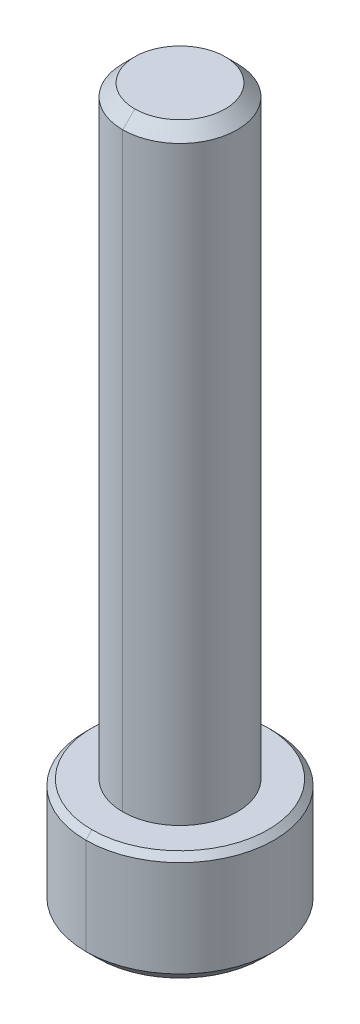
ISO-10303-21;
HEADER;
FILE_DESCRIPTION(('STEP AP214'),'2;1');
FILE_NAME('part.step','',(''),(''),'','','');
FILE_SCHEMA(('AUTOMOTIVE_DESIGN { 1 0 10303 214 1 1 1 1 }'));
ENDSEC;
DATA;
#1=APPLICATION_CONTEXT('core data for automotive mechanical design processes');
#2=APPLICATION_PROTOCOL_DEFINITION('international standard','automotive_design',2000,#1);
#3=PRODUCT_CONTEXT('',#1,'mechanical');
#4=PRODUCT('Part','Part','',(#3));
#5=PRODUCT_RELATED_PRODUCT_CATEGORY('part','',(#4));
#6=PRODUCT_DEFINITION_FORMATION('','',#4);
#7=PRODUCT_DEFINITION_CONTEXT('part definition',#1,'design');
#8=PRODUCT_DEFINITION('design','',#6,#7);
#9=PRODUCT_DEFINITION_SHAPE('','',#8);
#10=(LENGTH_UNIT() NAMED_UNIT(*) SI_UNIT(.MILLI.,.METRE.));
#11=(NAMED_UNIT(*) PLANE_ANGLE_UNIT() SI_UNIT($,.RADIAN.));
#12=(NAMED_UNIT(*) SI_UNIT($,.STERADIAN.) SOLID_ANGLE_UNIT());
#13=UNCERTAINTY_MEASURE_WITH_UNIT(LENGTH_MEASURE(1.E-05),#10,'distance_accuracy_value','');
#14=(GEOMETRIC_REPRESENTATION_CONTEXT(3) GLOBAL_UNCERTAINTY_ASSIGNED_CONTEXT((#13)) GLOBAL_UNIT_ASSIGNED_CONTEXT((#10,
#11,#12)) REPRESENTATION_CONTEXT('',''));
#15=CARTESIAN_POINT('',(0.,0.,0.));
#16=DIRECTION('',(0.,0.,1.));
#17=DIRECTION('',(1.,0.,0.));
#18=AXIS2_PLACEMENT_3D('',#15,#16,#17);
#19=CARTESIAN_POINT('',(0.,-0.253999999999994,0.));
#20=DIRECTION('',(0.,-1.,0.));
#21=DIRECTION('',(0.,0.,-1.));
#22=AXIS2_PLACEMENT_3D('',#19,#20,#21);
#23=CONICAL_SURFACE('',#22,3.96875,0.785398163397455);
#24=DIRECTION('',(0.,-0.707106781186543,0.707106781186552));
#25=VECTOR('',#24,1.);
#26=CARTESIAN_POINT('',(0.,-0.253999999999994,3.96875));
#27=LINE('',#26,#25);
#28=CARTESIAN_POINT('',(0.,0.,3.71475));
#29=VERTEX_POINT('',#28);
#30=CARTESIAN_POINT('',(0.,-0.253999999999994,3.96875));
#31=VERTEX_POINT('',#30);
#32=EDGE_CURVE('E181',#29,#31,#27,.T.);
#33=ORIENTED_EDGE('',*,*,#32,.F.);
#34=CARTESIAN_POINT('',(0.,0.,0.));
#35=DIRECTION('',(0.,1.,0.));
#36=DIRECTION('',(0.,0.,-1.));
#37=AXIS2_PLACEMENT_3D('',#34,#35,#36);
#38=CIRCLE('',#37,3.71475);
#39=CARTESIAN_POINT('',(0.,0.,-3.71475));
#40=VERTEX_POINT('',#39);
#41=EDGE_CURVE('E174',#40,#29,#38,.T.);
#42=ORIENTED_EDGE('',*,*,#41,.F.);
#43=DIRECTION('',(0.,-0.707106781186543,-0.707106781186552));
#44=VECTOR('',#43,1.);
#45=CARTESIAN_POINT('',(0.,-0.253999999999994,-3.96875));
#46=LINE('',#45,#44);
#47=CARTESIAN_POINT('',(0.,-0.253999999999994,-3.96875));
#48=VERTEX_POINT('',#47);
#49=EDGE_CURVE('E173',#40,#48,#46,.T.);
#50=ORIENTED_EDGE('',*,*,#49,.T.);
#51=CARTESIAN_POINT('',(0.,-0.253999999999994,0.));
#52=DIRECTION('',(0.,-1.,0.));
#53=DIRECTION('',(0.,0.,-1.));
#54=AXIS2_PLACEMENT_3D('',#51,#52,#53);
#55=CIRCLE('',#54,3.96875);
#56=EDGE_CURVE('E147',#31,#48,#55,.T.);
#57=ORIENTED_EDGE('',*,*,#56,.F.);
#58=EDGE_LOOP('',(#33,#42,#50,#57));
#59=FACE_BOUND('',#58,.T.);
#60=ADVANCED_FACE('F16',(#59),#23,.T.);
#61=CARTESIAN_POINT('',(0.,-4.826,0.));
#62=DIRECTION('',(0.,1.,0.));
#63=DIRECTION('',(0.,0.,1.));
#64=AXIS2_PLACEMENT_3D('',#61,#62,#63);
#65=CONICAL_SURFACE('',#64,3.46075,0.785398163397448);
#66=DIRECTION('',(0.,0.707106781186548,-0.707106781186548));
#67=VECTOR('',#66,1.);
#68=CARTESIAN_POINT('',(0.,-4.826,-3.46075));
#69=LINE('',#68,#67);
#70=CARTESIAN_POINT('',(0.,-4.826,-3.46075));
#71=VERTEX_POINT('',#70);
#72=CARTESIAN_POINT('',(0.,-4.318,-3.96875));
#73=VERTEX_POINT('',#72);
#74=EDGE_CURVE('E199',#71,#73,#69,.T.);
#75=ORIENTED_EDGE('',*,*,#74,.F.);
#76=CARTESIAN_POINT('',(0.,-4.826,0.));
#77=DIRECTION('',(0.,-1.,0.));
#78=DIRECTION('',(0.,0.,-1.));
#79=AXIS2_PLACEMENT_3D('',#76,#77,#78);
#80=CIRCLE('',#79,3.46075);
#81=CARTESIAN_POINT('',(0.,-4.826,3.46075));
#82=VERTEX_POINT('',#81);
#83=EDGE_CURVE('E158',#82,#71,#80,.T.);
#84=ORIENTED_EDGE('',*,*,#83,.F.);
#85=DIRECTION('',(0.,0.707106781186548,0.707106781186548));
#86=VECTOR('',#85,1.);
#87=CARTESIAN_POINT('',(0.,-4.826,3.46075));
#88=LINE('',#87,#86);
#89=CARTESIAN_POINT('',(0.,-4.318,3.96875));
#90=VERTEX_POINT('',#89);
#91=EDGE_CURVE('E169',#82,#90,#88,.T.);
#92=ORIENTED_EDGE('',*,*,#91,.T.);
#93=CARTESIAN_POINT('',(0.,-4.318,0.));
#94=DIRECTION('',(0.,1.,0.));
#95=DIRECTION('',(0.,0.,-1.));
#96=AXIS2_PLACEMENT_3D('',#93,#94,#95);
#97=CIRCLE('',#96,3.96875);
#98=EDGE_CURVE('E115',#73,#90,#97,.T.);
#99=ORIENTED_EDGE('',*,*,#98,.F.);
#100=EDGE_LOOP('',(#75,#84,#92,#99));
#101=FACE_BOUND('',#100,.T.);
#102=ADVANCED_FACE('F269',(#101),#65,.T.);
#103=CARTESIAN_POINT('',(1.984375,-1.8494248,-1.14567944042316));
#104=DIRECTION('',(1.,0.,0.));
#105=DIRECTION('',(0.,0.,-1.));
#106=AXIS2_PLACEMENT_3D('',#103,#104,#105);
#107=PLANE('',#106);
#108=DIRECTION('',(0.,-1.,0.));
#109=VECTOR('',#108,1.);
#110=CARTESIAN_POINT('',(1.984375,-1.8494248,-1.14567944042316));
#111=LINE('',#110,#109);
#112=CARTESIAN_POINT('',(1.984375,-1.8494248,-1.14567944042316));
#113=VERTEX_POINT('',#112);
#114=CARTESIAN_POINT('',(1.984375,-4.826,-1.14567944042316));
#115=VERTEX_POINT('',#114);
#116=EDGE_CURVE('E11',#113,#115,#111,.T.);
#117=ORIENTED_EDGE('',*,*,#116,.T.);
#118=CARTESIAN_POINT('',(1.984375,-4.826,-1.14567944042316));
#119=CARTESIAN_POINT('',(1.984375,-4.68036208510538,-0.854403610634551));
#120=CARTESIAN_POINT('',(1.984375,-4.60506326337506,-0.590680721420027));
#121=CARTESIAN_POINT('',(1.984375,-4.51924433500676,-0.29011272820971));
#122=CARTESIAN_POINT('',(1.984375,-4.51901637621626,-0.00101005810057195));
#123=CARTESIAN_POINT('',(1.984375,-4.51878865540112,0.287790806093884));
#124=CARTESIAN_POINT('',(1.984375,-4.60492537223951,0.590197211066081));
#125=CARTESIAN_POINT('',(1.984375,-4.67994195088672,0.853563342196651));
#126=CARTESIAN_POINT('',(1.984375,-4.826,1.14567944042317));
#127=B_SPLINE_CURVE_WITH_KNOTS('',2,(#118,#119,#120,#121,#122,#123,#124,#125,#126),
.UNSPECIFIED.,.F.,.F.,(3,2,2,2,3),(0.,0.25,0.5,0.75,1.),.UNSPECIFIED.);
#128=CARTESIAN_POINT('',(1.984375,-4.826,1.14567944042316));
#129=VERTEX_POINT('',#128);
#130=EDGE_CURVE('E251',#115,#129,#127,.T.);
#131=ORIENTED_EDGE('',*,*,#130,.T.);
#132=DIRECTION('',(0.,-1.,0.));
#133=VECTOR('',#132,1.);
#134=CARTESIAN_POINT('',(1.984375,-1.8494248,1.14567944042316));
#135=LINE('',#134,#133);
#136=CARTESIAN_POINT('',(1.984375,-1.8494248,1.14567944042316));
#137=VERTEX_POINT('',#136);
#138=EDGE_CURVE('E245',#137,#129,#135,.T.);
#139=ORIENTED_EDGE('',*,*,#138,.F.);
#140=DIRECTION('',(0.,0.,1.));
#141=VECTOR('',#140,1.);
#142=CARTESIAN_POINT('',(1.984375,-1.8494248,-1.14567944042316));
#143=LINE('',#142,#141);
#144=EDGE_CURVE('E214',#113,#137,#143,.T.);
#145=ORIENTED_EDGE('',*,*,#144,.F.);
#146=EDGE_LOOP('',(#117,#131,#139,#145));
#147=FACE_BOUND('',#146,.T.);
#148=ADVANCED_FACE('F258',(#147),#107,.F.);
#149=CARTESIAN_POINT('',(0.,-1.8494248,-2.29135888084633));
#150=DIRECTION('',(0.5,0.,-0.866025403784439));
#151=DIRECTION('',(0.,-1.,0.));
#152=AXIS2_PLACEMENT_3D('',#149,#150,#151);
#153=PLANE('',#152);
#154=DIRECTION('',(0.,-1.,0.));
#155=VECTOR('',#154,1.);
#156=CARTESIAN_POINT('',(0.,-1.8494248,-2.29135888084633));
#157=LINE('',#156,#155);
#158=CARTESIAN_POINT('',(0.,-1.8494248,-2.29135888084633));
#159=VERTEX_POINT('',#158);
#160=CARTESIAN_POINT('',(0.,-4.826,-2.29135888084633));
#161=VERTEX_POINT('',#160);
#162=EDGE_CURVE('E28',#159,#161,#157,.T.);
#163=ORIENTED_EDGE('',*,*,#162,.T.);
#164=CARTESIAN_POINT('',(0.,-4.826,-2.29135888084633));
#165=CARTESIAN_POINT('',(0.250705601837018,-4.68125505329205,-2.14661393413838));
#166=CARTESIAN_POINT('',(0.477795416201183,-4.60600373712399,-2.01550356868501));
#167=CARTESIAN_POINT('',(0.738188216368874,-4.51971672778291,-1.86516571541315));
#168=CARTESIAN_POINT('',(0.98853321615525,-4.51902060546134,-1.72062896239621));
#169=CARTESIAN_POINT('',(1.23842353131887,-4.51832574745947,-1.57635472166861));
#170=CARTESIAN_POINT('',(1.49993800055402,-4.60381766270318,-1.42536927245872));
#171=CARTESIAN_POINT('',(1.72956436293042,-4.67888501009477,-1.29279443032767));
#172=CARTESIAN_POINT('',(1.984375,-4.826,-1.14567944042316));
#173=B_SPLINE_CURVE_WITH_KNOTS('',2,(#164,#165,#166,#167,#168,#169,#170,#171,#172),
.UNSPECIFIED.,.F.,.F.,(3,2,2,2,3),(0.,0.25,0.5,0.75,1.),.UNSPECIFIED.);
#174=EDGE_CURVE('E331',#161,#115,#173,.T.);
#175=ORIENTED_EDGE('',*,*,#174,.T.);
#176=ORIENTED_EDGE('',*,*,#116,.F.);
#177=DIRECTION('',(0.866025403784439,0.,0.5));
#178=VECTOR('',#177,1.);
#179=CARTESIAN_POINT('',(0.,-1.8494248,-2.29135888084633));
#180=LINE('',#179,#178);
#181=EDGE_CURVE('E241',#159,#113,#180,.T.);
#182=ORIENTED_EDGE('',*,*,#181,.F.);
#183=EDGE_LOOP('',(#163,#175,#176,#182));
#184=FACE_BOUND('',#183,.T.);
#185=ADVANCED_FACE('F268',(#184),#153,.F.);
#186=CARTESIAN_POINT('',(-1.984375,-1.8494248,-1.14567944042316));
#187=DIRECTION('',(-0.5,0.,-0.866025403784439));
#188=DIRECTION('',(-0.866025403784439,0.,0.5));
#189=AXIS2_PLACEMENT_3D('',#186,#187,#188);
#190=PLANE('',#189);
#191=DIRECTION('',(0.,-1.,0.));
#192=VECTOR('',#191,1.);
#193=CARTESIAN_POINT('',(-1.984375,-1.8494248,-1.14567944042316));
#194=LINE('',#193,#192);
#195=CARTESIAN_POINT('',(-1.984375,-1.8494248,-1.14567944042316));
#196=VERTEX_POINT('',#195);
#197=CARTESIAN_POINT('',(-1.984375,-4.826,-1.14567944042316));
#198=VERTEX_POINT('',#197);
#199=EDGE_CURVE('E55',#196,#198,#194,.T.);
#200=ORIENTED_EDGE('',*,*,#199,.T.);
#201=CARTESIAN_POINT('',(-1.984375,-4.826,-1.14567944042316));
#202=CARTESIAN_POINT('',(-1.73366939816202,-4.6812550532915,-1.29042438713167));
#203=CARTESIAN_POINT('',(-1.50657958379882,-4.606003737124,-1.42153475258448));
#204=CARTESIAN_POINT('',(-1.24618678363029,-4.51971672778291,-1.57187260585682));
#205=CARTESIAN_POINT('',(-0.99584178384475,-4.51902060546134,-1.71640935887328));
#206=CARTESIAN_POINT('',(-0.745951468679565,-4.51832574745947,-1.86068359960178));
#207=CARTESIAN_POINT('',(-0.484436999445984,-4.60381766270318,-2.01166904881077));
#208=CARTESIAN_POINT('',(-0.254810637067759,-4.67888501009583,-2.14424389094287));
#209=CARTESIAN_POINT('',(0.,-4.826,-2.29135888084632));
#210=B_SPLINE_CURVE_WITH_KNOTS('',2,(#201,#202,#203,#204,#205,#206,#207,#208,#209),
.UNSPECIFIED.,.F.,.F.,(3,2,2,2,3),(0.,0.25,0.5,0.75,1.),.UNSPECIFIED.);
#211=EDGE_CURVE('E458',#198,#161,#210,.T.);
#212=ORIENTED_EDGE('',*,*,#211,.T.);
#213=ORIENTED_EDGE('',*,*,#162,.F.);
#214=DIRECTION('',(0.866025403784439,0.,-0.5));
#215=VECTOR('',#214,1.);
#216=CARTESIAN_POINT('',(-1.984375,-1.8494248,-1.14567944042316));
#217=LINE('',#216,#215);
#218=EDGE_CURVE('E219',#196,#159,#217,.T.);
#219=ORIENTED_EDGE('',*,*,#218,.F.);
#220=EDGE_LOOP('',(#200,#212,#213,#219));
#221=FACE_BOUND('',#220,.T.);
#222=ADVANCED_FACE('F347',(#221),#190,.F.);
#223=CARTESIAN_POINT('',(-1.984375,-1.8494248,1.14567944042316));
#224=DIRECTION('',(-1.,0.,0.));
#225=DIRECTION('',(0.,0.,1.));
#226=AXIS2_PLACEMENT_3D('',#223,#224,#225);
#227=PLANE('',#226);
#228=DIRECTION('',(0.,-1.,0.));
#229=VECTOR('',#228,1.);
#230=CARTESIAN_POINT('',(-1.984375,-1.8494248,1.14567944042316));
#231=LINE('',#230,#229);
#232=CARTESIAN_POINT('',(-1.984375,-1.8494248,1.14567944042316));
#233=VERTEX_POINT('',#232);
#234=CARTESIAN_POINT('',(-1.984375,-4.826,1.14567944042316));
#235=VERTEX_POINT('',#234);
#236=EDGE_CURVE('E382',#233,#235,#231,.T.);
#237=ORIENTED_EDGE('',*,*,#236,.T.);
#238=CARTESIAN_POINT('',(-1.984375,-4.826,1.14567944042316));
#239=CARTESIAN_POINT('',(-1.984375,-4.68036208510536,0.854403610634491));
#240=CARTESIAN_POINT('',(-1.984375,-4.60506326337506,0.590680721420027));
#241=CARTESIAN_POINT('',(-1.984375,-4.51924433500676,0.290112728209678));
#242=CARTESIAN_POINT('',(-1.984375,-4.51901637621626,0.00101005810056978));
#243=CARTESIAN_POINT('',(-1.984375,-4.51878865540112,-0.287790806093884));
#244=CARTESIAN_POINT('',(-1.984375,-4.60492537223951,-0.590197211066078));
#245=CARTESIAN_POINT('',(-1.984375,-4.67994195088672,-0.853563342196648));
#246=CARTESIAN_POINT('',(-1.984375,-4.826,-1.14567944042316));
#247=B_SPLINE_CURVE_WITH_KNOTS('',2,(#238,#239,#240,#241,#242,#243,#244,#245,#246),
.UNSPECIFIED.,.F.,.F.,(3,2,2,2,3),(0.,0.25,0.5,0.75,1.),.UNSPECIFIED.);
#248=EDGE_CURVE('E377',#235,#198,#247,.T.);
#249=ORIENTED_EDGE('',*,*,#248,.T.);
#250=ORIENTED_EDGE('',*,*,#199,.F.);
#251=DIRECTION('',(0.,0.,-1.));
#252=VECTOR('',#251,1.);
#253=CARTESIAN_POINT('',(-1.984375,-1.8494248,1.14567944042316));
#254=LINE('',#253,#252);
#255=EDGE_CURVE('E215',#233,#196,#254,.T.);
#256=ORIENTED_EDGE('',*,*,#255,.F.);
#257=EDGE_LOOP('',(#237,#249,#250,#256));
#258=FACE_BOUND('',#257,.T.);
#259=ADVANCED_FACE('F356',(#258),#227,.F.);
#260=CARTESIAN_POINT('',(0.,-1.8494248,2.29135888084633));
#261=DIRECTION('',(-0.5,0.,0.866025403784439));
#262=DIRECTION('',(0.,1.,0.));
#263=AXIS2_PLACEMENT_3D('',#260,#261,#262);
#264=PLANE('',#263);
#265=DIRECTION('',(0.,-1.,0.));
#266=VECTOR('',#265,1.);
#267=CARTESIAN_POINT('',(0.,-1.8494248,2.29135888084633));
#268=LINE('',#267,#266);
#269=CARTESIAN_POINT('',(0.,-1.8494248,2.29135888084633));
#270=VERTEX_POINT('',#269);
#271=CARTESIAN_POINT('',(0.,-4.826,2.29135888084633));
#272=VERTEX_POINT('',#271);
#273=EDGE_CURVE('E317',#270,#272,#268,.T.);
#274=ORIENTED_EDGE('',*,*,#273,.T.);
#275=CARTESIAN_POINT('',(0.,-4.826,2.29135888084633));
#276=CARTESIAN_POINT('',(-0.250705601836271,-4.68125505329248,2.14661393413881));
#277=CARTESIAN_POINT('',(-0.477795416201183,-4.606003737124,2.01550356868501));
#278=CARTESIAN_POINT('',(-0.738188216366829,-4.51971672778338,1.86516571541433));
#279=CARTESIAN_POINT('',(-0.988533216155249,-4.51902060546134,1.72062896239621));
#280=CARTESIAN_POINT('',(-1.23842353131898,-4.518325747459,1.57635472166855));
#281=CARTESIAN_POINT('',(-1.49993800055402,-4.60381766270318,1.42536927245872));
#282=CARTESIAN_POINT('',(-1.72956436293218,-4.67888501009579,1.29279443032665));
#283=CARTESIAN_POINT('',(-1.984375,-4.826,1.14567944042316));
#284=B_SPLINE_CURVE_WITH_KNOTS('',2,(#275,#276,#277,#278,#279,#280,#281,#282,#283),
.UNSPECIFIED.,.F.,.F.,(3,2,2,2,3),(0.,0.25,0.5,0.75,1.),.UNSPECIFIED.);
#285=EDGE_CURVE('E577',#272,#235,#284,.T.);
#286=ORIENTED_EDGE('',*,*,#285,.T.);
#287=ORIENTED_EDGE('',*,*,#236,.F.);
#288=DIRECTION('',(-0.866025403784439,0.,-0.5));
#289=VECTOR('',#288,1.);
#290=CARTESIAN_POINT('',(0.,-1.8494248,2.29135888084633));
#291=LINE('',#290,#289);
#292=EDGE_CURVE('E213',#270,#233,#291,.T.);
#293=ORIENTED_EDGE('',*,*,#292,.F.);
#294=EDGE_LOOP('',(#274,#286,#287,#293));
#295=FACE_BOUND('',#294,.T.);
#296=ADVANCED_FACE('F288',(#295),#264,.F.);
#297=CARTESIAN_POINT('',(1.984375,-1.8494248,1.14567944042316));
#298=DIRECTION('',(0.5,0.,0.866025403784438));
#299=DIRECTION('',(0.,-1.,0.));
#300=AXIS2_PLACEMENT_3D('',#297,#298,#299);
#301=PLANE('',#300);
#302=ORIENTED_EDGE('',*,*,#138,.T.);
#303=CARTESIAN_POINT('',(1.984375,-4.826,1.14567944042316));
#304=CARTESIAN_POINT('',(1.73366939816205,-4.68125505329151,1.29042438713165));
#305=CARTESIAN_POINT('',(1.50657958379882,-4.606003737124,1.42153475258448));
#306=CARTESIAN_POINT('',(1.24618678363103,-4.51971672778314,1.5718726058564));
#307=CARTESIAN_POINT('',(0.995841783844754,-4.51902060546134,1.71640935887328));
#308=CARTESIAN_POINT('',(0.745951468680323,-4.51832574745923,1.86068359960134));
#309=CARTESIAN_POINT('',(0.484436999445986,-4.60381766270318,2.01166904881077));
#310=CARTESIAN_POINT('',(0.254810637067813,-4.67888501009579,2.14424389094284));
#311=CARTESIAN_POINT('',(0.,-4.826,2.29135888084632));
#312=B_SPLINE_CURVE_WITH_KNOTS('',2,(#303,#304,#305,#306,#307,#308,#309,#310,#311),
.UNSPECIFIED.,.F.,.F.,(3,2,2,2,3),(0.,0.25,0.5,0.75,1.),.UNSPECIFIED.);
#313=EDGE_CURVE('E572',#129,#272,#312,.T.);
#314=ORIENTED_EDGE('',*,*,#313,.T.);
#315=ORIENTED_EDGE('',*,*,#273,.F.);
#316=DIRECTION('',(-0.866025403784439,0.,0.5));
#317=VECTOR('',#316,1.);
#318=CARTESIAN_POINT('',(1.984375,-1.8494248,1.14567944042316));
#319=LINE('',#318,#317);
#320=EDGE_CURVE('E209',#137,#270,#319,.T.);
#321=ORIENTED_EDGE('',*,*,#320,.F.);
#322=EDGE_LOOP('',(#302,#314,#315,#321));
#323=FACE_BOUND('',#322,.T.);
#324=ADVANCED_FACE('F348',(#323),#301,.F.);
#325=CARTESIAN_POINT('',(0.,-1.8494248,0.));
#326=DIRECTION('',(0.,-1.,0.));
#327=DIRECTION('',(0.,0.,-1.));
#328=AXIS2_PLACEMENT_3D('',#325,#326,#327);
#329=PLANE('',#328);
#330=ORIENTED_EDGE('',*,*,#144,.T.);
#331=ORIENTED_EDGE('',*,*,#320,.T.);
#332=ORIENTED_EDGE('',*,*,#292,.T.);
#333=ORIENTED_EDGE('',*,*,#255,.T.);
#334=ORIENTED_EDGE('',*,*,#218,.T.);
#335=ORIENTED_EDGE('',*,*,#181,.T.);
#336=EDGE_LOOP('',(#330,#331,#332,#333,#334,#335));
#337=FACE_BOUND('',#336,.T.);
#338=ADVANCED_FACE('F286',(#337),#329,.T.);
#339=CARTESIAN_POINT('',(0.,-4.826,0.));
#340=DIRECTION('',(0.,-1.,0.));
#341=DIRECTION('',(0.,0.,-1.));
#342=AXIS2_PLACEMENT_3D('',#339,#340,#341);
#343=CONICAL_SURFACE('',#342,2.29135888084632,0.78539816339745);
#344=CARTESIAN_POINT('',(0.,-4.826,0.));
#345=DIRECTION('',(0.,-1.,0.));
#346=DIRECTION('',(0.,0.,-1.));
#347=AXIS2_PLACEMENT_3D('',#344,#345,#346);
#348=CIRCLE('',#347,2.29135888084632);
#349=EDGE_CURVE('E301',#115,#129,#348,.T.);
#350=ORIENTED_EDGE('',*,*,#349,.T.);
#351=ORIENTED_EDGE('',*,*,#130,.F.);
#352=EDGE_LOOP('',(#350,#351));
#353=FACE_BOUND('',#352,.T.);
#354=ADVANCED_FACE('F281',(#353),#343,.F.);
#355=CARTESIAN_POINT('',(0.,-4.826,0.));
#356=DIRECTION('',(0.,-1.,0.));
#357=DIRECTION('',(0.,0.,-1.));
#358=AXIS2_PLACEMENT_3D('',#355,#356,#357);
#359=CONICAL_SURFACE('',#358,2.29135888084632,0.78539816339745);
#360=CARTESIAN_POINT('',(0.,-4.826,0.));
#361=DIRECTION('',(0.,-1.,0.));
#362=DIRECTION('',(0.,0.,-1.));
#363=AXIS2_PLACEMENT_3D('',#360,#361,#362);
#364=CIRCLE('',#363,2.29135888084632);
#365=EDGE_CURVE('E208',#161,#115,#364,.T.);
#366=ORIENTED_EDGE('',*,*,#365,.T.);
#367=ORIENTED_EDGE('',*,*,#174,.F.);
#368=EDGE_LOOP('',(#366,#367));
#369=FACE_BOUND('',#368,.T.);
#370=ADVANCED_FACE('F285',(#369),#359,.F.);
#371=CARTESIAN_POINT('',(0.,-4.826,0.));
#372=DIRECTION('',(0.,-1.,0.));
#373=DIRECTION('',(0.,0.,-1.));
#374=AXIS2_PLACEMENT_3D('',#371,#372,#373);
#375=CONICAL_SURFACE('',#374,2.29135888084632,0.78539816339745);
#376=CARTESIAN_POINT('',(0.,-4.826,0.));
#377=DIRECTION('',(0.,-1.,0.));
#378=DIRECTION('',(0.,0.,-1.));
#379=AXIS2_PLACEMENT_3D('',#376,#377,#378);
#380=CIRCLE('',#379,2.29135888084632);
#381=EDGE_CURVE('E311',#198,#161,#380,.T.);
#382=ORIENTED_EDGE('',*,*,#381,.T.);
#383=ORIENTED_EDGE('',*,*,#211,.F.);
#384=EDGE_LOOP('',(#382,#383));
#385=FACE_BOUND('',#384,.T.);
#386=ADVANCED_FACE('F393',(#385),#375,.F.);
#387=CARTESIAN_POINT('',(0.,-4.826,0.));
#388=DIRECTION('',(0.,-1.,0.));
#389=DIRECTION('',(0.,0.,-1.));
#390=AXIS2_PLACEMENT_3D('',#387,#388,#389);
#391=CONICAL_SURFACE('',#390,2.29135888084632,0.78539816339745);
#392=CARTESIAN_POINT('',(0.,-4.826,0.));
#393=DIRECTION('',(0.,-1.,0.));
#394=DIRECTION('',(0.,0.,-1.));
#395=AXIS2_PLACEMENT_3D('',#392,#393,#394);
#396=CIRCLE('',#395,2.29135888084632);
#397=EDGE_CURVE('E433',#235,#198,#396,.T.);
#398=ORIENTED_EDGE('',*,*,#397,.T.);
#399=ORIENTED_EDGE('',*,*,#248,.F.);
#400=EDGE_LOOP('',(#398,#399));
#401=FACE_BOUND('',#400,.T.);
#402=ADVANCED_FACE('F384',(#401),#391,.F.);
#403=CARTESIAN_POINT('',(0.,-4.826,0.));
#404=DIRECTION('',(0.,-1.,0.));
#405=DIRECTION('',(0.,0.,-1.));
#406=AXIS2_PLACEMENT_3D('',#403,#404,#405);
#407=CONICAL_SURFACE('',#406,2.29135888084632,0.78539816339745);
#408=CARTESIAN_POINT('',(0.,-4.826,0.));
#409=DIRECTION('',(0.,-1.,0.));
#410=DIRECTION('',(0.,0.,-1.));
#411=AXIS2_PLACEMENT_3D('',#408,#409,#410);
#412=CIRCLE('',#411,2.29135888084632);
#413=EDGE_CURVE('E323',#272,#235,#412,.T.);
#414=ORIENTED_EDGE('',*,*,#413,.T.);
#415=ORIENTED_EDGE('',*,*,#285,.F.);
#416=EDGE_LOOP('',(#414,#415));
#417=FACE_BOUND('',#416,.T.);
#418=ADVANCED_FACE('F270',(#417),#407,.F.);
#419=CARTESIAN_POINT('',(0.,-4.826,0.));
#420=DIRECTION('',(0.,-1.,0.));
#421=DIRECTION('',(0.,0.,-1.));
#422=AXIS2_PLACEMENT_3D('',#419,#420,#421);
#423=CONICAL_SURFACE('',#422,2.29135888084632,0.78539816339745);
#424=CARTESIAN_POINT('',(0.,-4.826,0.));
#425=DIRECTION('',(0.,-1.,0.));
#426=DIRECTION('',(0.,0.,-1.));
#427=AXIS2_PLACEMENT_3D('',#424,#425,#426);
#428=CIRCLE('',#427,2.29135888084632);
#429=EDGE_CURVE('E305',#129,#272,#428,.T.);
#430=ORIENTED_EDGE('',*,*,#429,.T.);
#431=ORIENTED_EDGE('',*,*,#313,.F.);
#432=EDGE_LOOP('',(#430,#431));
#433=FACE_BOUND('',#432,.T.);
#434=ADVANCED_FACE('F279',(#433),#423,.F.);
#435=CARTESIAN_POINT('',(0.,0.,0.));
#436=DIRECTION('',(0.,-1.,0.));
#437=DIRECTION('',(0.,0.,-1.));
#438=AXIS2_PLACEMENT_3D('',#435,#436,#437);
#439=PLANE('',#438);
#440=CARTESIAN_POINT('',(0.,0.,0.));
#441=DIRECTION('',(0.,1.,0.));
#442=DIRECTION('',(0.,0.,1.));
#443=AXIS2_PLACEMENT_3D('',#440,#441,#442);
#444=CIRCLE('',#443,2.413);
#445=CARTESIAN_POINT('',(0.,0.,-2.413));
#446=VERTEX_POINT('',#445);
#447=CARTESIAN_POINT('',(0.,0.,2.413));
#448=VERTEX_POINT('',#447);
#449=EDGE_CURVE('E236',#446,#448,#444,.T.);
#450=ORIENTED_EDGE('',*,*,#449,.F.);
#451=CARTESIAN_POINT('',(0.,0.,0.));
#452=DIRECTION('',(0.,1.,0.));
#453=DIRECTION('',(0.,0.,1.));
#454=AXIS2_PLACEMENT_3D('',#451,#452,#453);
#455=CIRCLE('',#454,2.413);
#456=EDGE_CURVE('E200',#448,#446,#455,.T.);
#457=ORIENTED_EDGE('',*,*,#456,.F.);
#458=EDGE_LOOP('',(#450,#457));
#459=FACE_BOUND('',#458,.T.);
#460=ORIENTED_EDGE('',*,*,#41,.T.);
#461=CARTESIAN_POINT('',(0.,0.,0.));
#462=DIRECTION('',(0.,1.,0.));
#463=DIRECTION('',(0.,0.,-1.));
#464=AXIS2_PLACEMENT_3D('',#461,#462,#463);
#465=CIRCLE('',#464,3.71475);
#466=EDGE_CURVE('E188',#29,#40,#465,.T.);
#467=ORIENTED_EDGE('',*,*,#466,.T.);
#468=EDGE_LOOP('',(#460,#467));
#469=FACE_BOUND('',#468,.T.);
#470=ADVANCED_FACE('F275',(#459,#469),#439,.F.);
#471=CARTESIAN_POINT('',(0.,-4.826,0.));
#472=DIRECTION('',(0.,-1.,0.));
#473=DIRECTION('',(0.,0.,-1.));
#474=AXIS2_PLACEMENT_3D('',#471,#472,#473);
#475=PLANE('',#474);
#476=ORIENTED_EDGE('',*,*,#365,.F.);
#477=ORIENTED_EDGE('',*,*,#381,.F.);
#478=ORIENTED_EDGE('',*,*,#397,.F.);
#479=ORIENTED_EDGE('',*,*,#413,.F.);
#480=ORIENTED_EDGE('',*,*,#429,.F.);
#481=ORIENTED_EDGE('',*,*,#349,.F.);
#482=EDGE_LOOP('',(#476,#477,#478,#479,#480,#481));
#483=FACE_BOUND('',#482,.T.);
#484=ORIENTED_EDGE('',*,*,#83,.T.);
#485=CARTESIAN_POINT('',(0.,-4.826,0.));
#486=DIRECTION('',(0.,-1.,0.));
#487=DIRECTION('',(0.,0.,-1.));
#488=AXIS2_PLACEMENT_3D('',#485,#486,#487);
#489=CIRCLE('',#488,3.46075);
#490=EDGE_CURVE('E179',#71,#82,#489,.T.);
#491=ORIENTED_EDGE('',*,*,#490,.T.);
#492=EDGE_LOOP('',(#484,#491));
#493=FACE_BOUND('',#492,.T.);
#494=ADVANCED_FACE('F278',(#483,#493),#475,.T.);
#495=CARTESIAN_POINT('',(0.,-4.826,0.));
#496=DIRECTION('',(0.,1.,0.));
#497=DIRECTION('',(0.,0.,1.));
#498=AXIS2_PLACEMENT_3D('',#495,#496,#497);
#499=CYLINDRICAL_SURFACE('',#498,3.96875);
#500=DIRECTION('',(0.,1.,0.));
#501=VECTOR('',#500,1.);
#502=CARTESIAN_POINT('',(0.,-4.826,-3.96875));
#503=LINE('',#502,#501);
#504=EDGE_CURVE('E150',#73,#48,#503,.T.);
#505=ORIENTED_EDGE('',*,*,#504,.F.);
#506=ORIENTED_EDGE('',*,*,#98,.T.);
#507=DIRECTION('',(0.,1.,0.));
#508=VECTOR('',#507,1.);
#509=CARTESIAN_POINT('',(0.,-4.826,3.96875));
#510=LINE('',#509,#508);
#511=EDGE_CURVE('E152',#90,#31,#510,.T.);
#512=ORIENTED_EDGE('',*,*,#511,.T.);
#513=ORIENTED_EDGE('',*,*,#56,.T.);
#514=EDGE_LOOP('',(#505,#506,#512,#513));
#515=FACE_BOUND('',#514,.T.);
#516=ADVANCED_FACE('F149',(#515),#499,.T.);
#517=CARTESIAN_POINT('',(0.,25.4,0.));
#518=DIRECTION('',(0.,-1.,0.));
#519=DIRECTION('',(0.,0.,-1.));
#520=AXIS2_PLACEMENT_3D('',#517,#518,#519);
#521=CONICAL_SURFACE('',#520,1.905,0.785398163397446);
#522=DIRECTION('',(0.,-0.707106781186549,0.707106781186546));
#523=VECTOR('',#522,1.);
#524=CARTESIAN_POINT('',(0.,25.4,1.905));
#525=LINE('',#524,#523);
#526=CARTESIAN_POINT('',(0.,25.4,1.905));
#527=VERTEX_POINT('',#526);
#528=CARTESIAN_POINT('',(0.,24.892,2.413));
#529=VERTEX_POINT('',#528);
#530=EDGE_CURVE('E229',#527,#529,#525,.T.);
#531=ORIENTED_EDGE('',*,*,#530,.F.);
#532=CARTESIAN_POINT('',(0.,25.4,0.));
#533=DIRECTION('',(0.,1.,0.));
#534=DIRECTION('',(0.,0.,1.));
#535=AXIS2_PLACEMENT_3D('',#532,#533,#534);
#536=CIRCLE('',#535,1.905);
#537=CARTESIAN_POINT('',(0.,25.4,-1.905));
#538=VERTEX_POINT('',#537);
#539=EDGE_CURVE('E194',#538,#527,#536,.T.);
#540=ORIENTED_EDGE('',*,*,#539,.F.);
#541=DIRECTION('',(0.,-0.707106781186549,-0.707106781186546));
#542=VECTOR('',#541,1.);
#543=CARTESIAN_POINT('',(0.,25.4,-1.905));
#544=LINE('',#543,#542);
#545=CARTESIAN_POINT('',(0.,24.892,-2.413));
#546=VERTEX_POINT('',#545);
#547=EDGE_CURVE('E228',#538,#546,#544,.T.);
#548=ORIENTED_EDGE('',*,*,#547,.T.);
#549=CARTESIAN_POINT('',(0.,24.892,0.));
#550=DIRECTION('',(0.,-1.,0.));
#551=DIRECTION('',(0.,0.,1.));
#552=AXIS2_PLACEMENT_3D('',#549,#550,#551);
#553=CIRCLE('',#552,2.413);
#554=EDGE_CURVE('E223',#529,#546,#553,.T.);
#555=ORIENTED_EDGE('',*,*,#554,.F.);
#556=EDGE_LOOP('',(#531,#540,#548,#555));
#557=FACE_BOUND('',#556,.T.);
#558=ADVANCED_FACE('F398',(#557),#521,.T.);
#559=CARTESIAN_POINT('',(0.,25.4,0.));
#560=DIRECTION('',(0.,1.,0.));
#561=DIRECTION('',(1.,0.,0.));
#562=AXIS2_PLACEMENT_3D('',#559,#560,#561);
#563=PLANE('',#562);
#564=ORIENTED_EDGE('',*,*,#539,.T.);
#565=CARTESIAN_POINT('',(0.,25.4,0.));
#566=DIRECTION('',(0.,1.,0.));
#567=DIRECTION('',(0.,0.,1.));
#568=AXIS2_PLACEMENT_3D('',#565,#566,#567);
#569=CIRCLE('',#568,1.905);
#570=EDGE_CURVE('E232',#527,#538,#569,.T.);
#571=ORIENTED_EDGE('',*,*,#570,.T.);
#572=EDGE_LOOP('',(#564,#571));
#573=FACE_BOUND('',#572,.T.);
#574=ADVANCED_FACE('F401',(#573),#563,.T.);
#575=CARTESIAN_POINT('',(0.,25.4,0.));
#576=DIRECTION('',(0.,-1.,0.));
#577=DIRECTION('',(0.,0.,-1.));
#578=AXIS2_PLACEMENT_3D('',#575,#576,#577);
#579=CYLINDRICAL_SURFACE('',#578,2.413);
#580=DIRECTION('',(0.,-1.,0.));
#581=VECTOR('',#580,1.);
#582=CARTESIAN_POINT('',(0.,25.4,2.413));
#583=LINE('',#582,#581);
#584=EDGE_CURVE('E205',#529,#448,#583,.T.);
#585=ORIENTED_EDGE('',*,*,#584,.F.);
#586=ORIENTED_EDGE('',*,*,#554,.T.);
#587=DIRECTION('',(0.,-1.,0.));
#588=VECTOR('',#587,1.);
#589=CARTESIAN_POINT('',(0.,25.4,-2.413));
#590=LINE('',#589,#588);
#591=EDGE_CURVE('E204',#546,#446,#590,.T.);
#592=ORIENTED_EDGE('',*,*,#591,.T.);
#593=ORIENTED_EDGE('',*,*,#449,.T.);
#594=EDGE_LOOP('',(#585,#586,#592,#593));
#595=FACE_BOUND('',#594,.T.);
#596=ADVANCED_FACE('F403',(#595),#579,.T.);
#597=CARTESIAN_POINT('',(0.,25.4,0.));
#598=DIRECTION('',(0.,-1.,0.));
#599=DIRECTION('',(0.,0.,-1.));
#600=AXIS2_PLACEMENT_3D('',#597,#598,#599);
#601=CYLINDRICAL_SURFACE('',#600,2.413);
#602=CARTESIAN_POINT('',(0.,24.892,0.));
#603=DIRECTION('',(0.,-1.,0.));
#604=DIRECTION('',(0.,0.,1.));
#605=AXIS2_PLACEMENT_3D('',#602,#603,#604);
#606=CIRCLE('',#605,2.413);
#607=EDGE_CURVE('E224',#546,#529,#606,.T.);
#608=ORIENTED_EDGE('',*,*,#607,.T.);
#609=ORIENTED_EDGE('',*,*,#584,.T.);
#610=ORIENTED_EDGE('',*,*,#456,.T.);
#611=ORIENTED_EDGE('',*,*,#591,.F.);
#612=EDGE_LOOP('',(#608,#609,#610,#611));
#613=FACE_BOUND('',#612,.T.);
#614=ADVANCED_FACE('F406',(#613),#601,.T.);
#615=CARTESIAN_POINT('',(0.,25.4,0.));
#616=DIRECTION('',(0.,-1.,0.));
#617=DIRECTION('',(0.,0.,-1.));
#618=AXIS2_PLACEMENT_3D('',#615,#616,#617);
#619=CONICAL_SURFACE('',#618,1.905,0.785398163397446);
#620=ORIENTED_EDGE('',*,*,#570,.F.);
#621=ORIENTED_EDGE('',*,*,#530,.T.);
#622=ORIENTED_EDGE('',*,*,#607,.F.);
#623=ORIENTED_EDGE('',*,*,#547,.F.);
#624=EDGE_LOOP('',(#620,#621,#622,#623));
#625=FACE_BOUND('',#624,.T.);
#626=ADVANCED_FACE('F397',(#625),#619,.T.);
#627=CARTESIAN_POINT('',(0.,-4.826,0.));
#628=DIRECTION('',(0.,1.,0.));
#629=DIRECTION('',(0.,0.,1.));
#630=AXIS2_PLACEMENT_3D('',#627,#628,#629);
#631=CYLINDRICAL_SURFACE('',#630,3.96875);
#632=CARTESIAN_POINT('',(0.,-4.318,0.));
#633=DIRECTION('',(0.,1.,0.));
#634=DIRECTION('',(0.,0.,-1.));
#635=AXIS2_PLACEMENT_3D('',#632,#633,#634);
#636=CIRCLE('',#635,3.96875);
#637=EDGE_CURVE('E166',#90,#73,#636,.T.);
#638=ORIENTED_EDGE('',*,*,#637,.T.);
#639=ORIENTED_EDGE('',*,*,#504,.T.);
#640=CARTESIAN_POINT('',(0.,-0.253999999999994,0.));
#641=DIRECTION('',(0.,-1.,0.));
#642=DIRECTION('',(0.,0.,-1.));
#643=AXIS2_PLACEMENT_3D('',#640,#641,#642);
#644=CIRCLE('',#643,3.96875);
#645=EDGE_CURVE('E163',#48,#31,#644,.T.);
#646=ORIENTED_EDGE('',*,*,#645,.T.);
#647=ORIENTED_EDGE('',*,*,#511,.F.);
#648=EDGE_LOOP('',(#638,#639,#646,#647));
#649=FACE_BOUND('',#648,.T.);
#650=ADVANCED_FACE('F161',(#649),#631,.T.);
#651=CARTESIAN_POINT('',(0.,-4.826,0.));
#652=DIRECTION('',(0.,1.,0.));
#653=DIRECTION('',(0.,0.,1.));
#654=AXIS2_PLACEMENT_3D('',#651,#652,#653);
#655=CONICAL_SURFACE('',#654,3.46075,0.785398163397448);
#656=ORIENTED_EDGE('',*,*,#490,.F.);
#657=ORIENTED_EDGE('',*,*,#74,.T.);
#658=ORIENTED_EDGE('',*,*,#637,.F.);
#659=ORIENTED_EDGE('',*,*,#91,.F.);
#660=EDGE_LOOP('',(#656,#657,#658,#659));
#661=FACE_BOUND('',#660,.T.);
#662=ADVANCED_FACE('F396',(#661),#655,.T.);
#663=CARTESIAN_POINT('',(0.,-0.253999999999994,0.));
#664=DIRECTION('',(0.,-1.,0.));
#665=DIRECTION('',(0.,0.,-1.));
#666=AXIS2_PLACEMENT_3D('',#663,#664,#665);
#667=CONICAL_SURFACE('',#666,3.96875,0.785398163397455);
#668=ORIENTED_EDGE('',*,*,#466,.F.);
#669=ORIENTED_EDGE('',*,*,#32,.T.);
#670=ORIENTED_EDGE('',*,*,#645,.F.);
#671=ORIENTED_EDGE('',*,*,#49,.F.);
#672=EDGE_LOOP('',(#668,#669,#670,#671));
#673=FACE_BOUND('',#672,.T.);
#674=ADVANCED_FACE('F18',(#673),#667,.T.);
#675=CLOSED_SHELL('',(#60,#102,#148,#185,#222,#259,#296,#324,#338,#354,#370,#386,#402,#418,#434,
#470,#494,#516,#558,#574,#596,#614,#626,#650,#662,#674));
#676=MANIFOLD_SOLID_BREP('B1',#675);
#677=ADVANCED_BREP_SHAPE_REPRESENTATION('',(#18,#676),#14);
#678=SHAPE_DEFINITION_REPRESENTATION(#9,#677);
ENDSEC;
END-ISO-10303-21;
